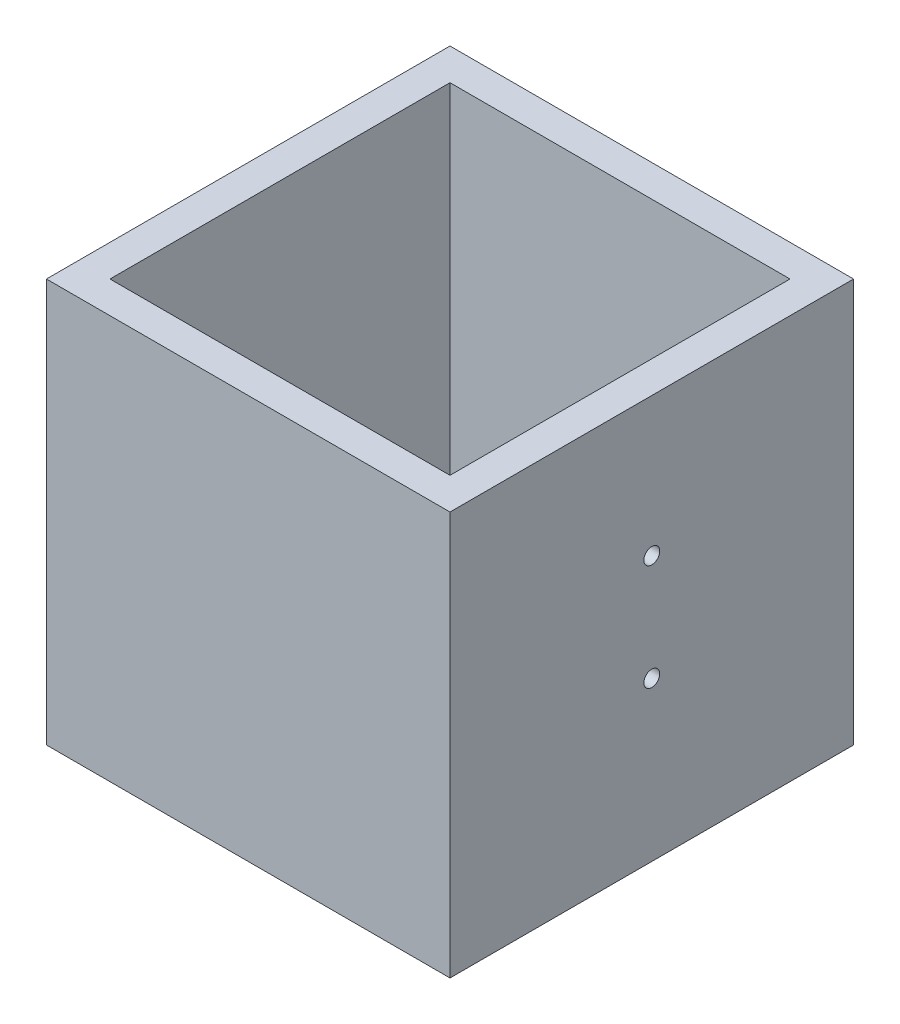
ISO-10303-21;
HEADER;
FILE_DESCRIPTION(('STEP AP214'),'2;1');
FILE_NAME('part.step','',(''),(''),'','','');
FILE_SCHEMA(('AUTOMOTIVE_DESIGN { 1 0 10303 214 1 1 1 1 }'));
ENDSEC;
DATA;
#1=APPLICATION_CONTEXT('core data for automotive mechanical design processes');
#2=APPLICATION_PROTOCOL_DEFINITION('international standard','automotive_design',2000,#1);
#3=PRODUCT_CONTEXT('',#1,'mechanical');
#4=PRODUCT('Part','Part','',(#3));
#5=PRODUCT_RELATED_PRODUCT_CATEGORY('part','',(#4));
#6=PRODUCT_DEFINITION_FORMATION('','',#4);
#7=PRODUCT_DEFINITION_CONTEXT('part definition',#1,'design');
#8=PRODUCT_DEFINITION('design','',#6,#7);
#9=PRODUCT_DEFINITION_SHAPE('','',#8);
#10=(LENGTH_UNIT() NAMED_UNIT(*) SI_UNIT(.MILLI.,.METRE.));
#11=(NAMED_UNIT(*) PLANE_ANGLE_UNIT() SI_UNIT($,.RADIAN.));
#12=(NAMED_UNIT(*) SI_UNIT($,.STERADIAN.) SOLID_ANGLE_UNIT());
#13=UNCERTAINTY_MEASURE_WITH_UNIT(LENGTH_MEASURE(1.E-05),#10,'distance_accuracy_value','');
#14=(GEOMETRIC_REPRESENTATION_CONTEXT(3) GLOBAL_UNCERTAINTY_ASSIGNED_CONTEXT((#13)) GLOBAL_UNIT_ASSIGNED_CONTEXT((#10,
#11,#12)) REPRESENTATION_CONTEXT('',''));
#15=CARTESIAN_POINT('',(0.,0.,0.));
#16=DIRECTION('',(0.,0.,1.));
#17=DIRECTION('',(1.,0.,0.));
#18=AXIS2_PLACEMENT_3D('',#15,#16,#17);
#19=CARTESIAN_POINT('',(-12.7,25.4,12.7));
#20=DIRECTION('',(1.,0.,0.));
#21=DIRECTION('',(0.,0.,-1.));
#22=AXIS2_PLACEMENT_3D('',#19,#20,#21);
#23=PLANE('',#22);
#24=DIRECTION('',(0.,0.,1.));
#25=VECTOR('',#24,1.);
#26=CARTESIAN_POINT('',(-12.7,0.,12.7));
#27=LINE('',#26,#25);
#28=CARTESIAN_POINT('',(-12.7,0.,-12.7));
#29=VERTEX_POINT('',#28);
#30=CARTESIAN_POINT('',(-12.7,0.,12.7));
#31=VERTEX_POINT('',#30);
#32=EDGE_CURVE('E213',#29,#31,#27,.T.);
#33=ORIENTED_EDGE('',*,*,#32,.T.);
#34=DIRECTION('',(0.,-1.,0.));
#35=VECTOR('',#34,1.);
#36=CARTESIAN_POINT('',(-12.7,25.4,12.7));
#37=LINE('',#36,#35);
#38=CARTESIAN_POINT('',(-12.7,25.4,12.7));
#39=VERTEX_POINT('',#38);
#40=EDGE_CURVE('E218',#39,#31,#37,.T.);
#41=ORIENTED_EDGE('',*,*,#40,.F.);
#42=DIRECTION('',(0.,0.,1.));
#43=VECTOR('',#42,1.);
#44=CARTESIAN_POINT('',(-12.7,25.4,12.7));
#45=LINE('',#44,#43);
#46=CARTESIAN_POINT('',(-12.7,25.4,-12.7));
#47=VERTEX_POINT('',#46);
#48=EDGE_CURVE('E204',#47,#39,#45,.T.);
#49=ORIENTED_EDGE('',*,*,#48,.F.);
#50=DIRECTION('',(0.,-1.,0.));
#51=VECTOR('',#50,1.);
#52=CARTESIAN_POINT('',(-12.7,25.4,-12.7));
#53=LINE('',#52,#51);
#54=EDGE_CURVE('E46',#47,#29,#53,.T.);
#55=ORIENTED_EDGE('',*,*,#54,.T.);
#56=EDGE_LOOP('',(#33,#41,#49,#55));
#57=FACE_BOUND('',#56,.T.);
#58=DIRECTION('',(0.,0.,1.));
#59=VECTOR('',#58,1.);
#60=CARTESIAN_POINT('',(-12.7,1.5,0.));
#61=LINE('',#60,#59);
#62=CARTESIAN_POINT('',(-12.7,1.5,-11.2));
#63=VERTEX_POINT('',#62);
#64=CARTESIAN_POINT('',(-12.7,1.5,11.2));
#65=VERTEX_POINT('',#64);
#66=EDGE_CURVE('E136',#63,#65,#61,.T.);
#67=ORIENTED_EDGE('',*,*,#66,.F.);
#68=DIRECTION('',(0.,-1.,0.));
#69=VECTOR('',#68,1.);
#70=CARTESIAN_POINT('',(-12.7,25.4,-11.2));
#71=LINE('',#70,#69);
#72=CARTESIAN_POINT('',(-12.7,23.9,-11.2));
#73=VERTEX_POINT('',#72);
#74=EDGE_CURVE('E144',#73,#63,#71,.T.);
#75=ORIENTED_EDGE('',*,*,#74,.F.);
#76=DIRECTION('',(0.,0.,1.));
#77=VECTOR('',#76,1.);
#78=CARTESIAN_POINT('',(-12.7,23.9,0.));
#79=LINE('',#78,#77);
#80=CARTESIAN_POINT('',(-12.7,23.9,11.2));
#81=VERTEX_POINT('',#80);
#82=EDGE_CURVE('E54',#73,#81,#79,.T.);
#83=ORIENTED_EDGE('',*,*,#82,.T.);
#84=DIRECTION('',(0.,-1.,0.));
#85=VECTOR('',#84,1.);
#86=CARTESIAN_POINT('',(-12.7,25.4,11.2));
#87=LINE('',#86,#85);
#88=EDGE_CURVE('E149',#81,#65,#87,.T.);
#89=ORIENTED_EDGE('',*,*,#88,.T.);
#90=EDGE_LOOP('',(#67,#75,#83,#89));
#91=FACE_BOUND('',#90,.T.);
#92=ADVANCED_FACE('F37',(#57,#91),#23,.F.);
#93=CARTESIAN_POINT('',(0.,25.4,0.));
#94=DIRECTION('',(0.,-1.,0.));
#95=DIRECTION('',(0.,0.,-1.));
#96=AXIS2_PLACEMENT_3D('',#93,#94,#95);
#97=PLANE('',#96);
#98=DIRECTION('',(0.,0.,-1.));
#99=VECTOR('',#98,1.);
#100=CARTESIAN_POINT('',(12.7,25.4,12.7));
#101=LINE('',#100,#99);
#102=CARTESIAN_POINT('',(12.7,25.4,12.7));
#103=VERTEX_POINT('',#102);
#104=CARTESIAN_POINT('',(12.7,25.4,-12.7));
#105=VERTEX_POINT('',#104);
#106=EDGE_CURVE('E198',#103,#105,#101,.T.);
#107=ORIENTED_EDGE('',*,*,#106,.T.);
#108=DIRECTION('',(-1.,0.,0.));
#109=VECTOR('',#108,1.);
#110=CARTESIAN_POINT('',(-12.7,25.4,-12.7));
#111=LINE('',#110,#109);
#112=EDGE_CURVE('E201',#105,#47,#111,.T.);
#113=ORIENTED_EDGE('',*,*,#112,.T.);
#114=ORIENTED_EDGE('',*,*,#48,.T.);
#115=DIRECTION('',(1.,0.,0.));
#116=VECTOR('',#115,1.);
#117=CARTESIAN_POINT('',(-12.7,25.4,12.7));
#118=LINE('',#117,#116);
#119=EDGE_CURVE('E206',#39,#103,#118,.T.);
#120=ORIENTED_EDGE('',*,*,#119,.T.);
#121=EDGE_LOOP('',(#107,#113,#114,#120));
#122=FACE_BOUND('',#121,.T.);
#123=DIRECTION('',(0.,0.,-1.));
#124=VECTOR('',#123,1.);
#125=CARTESIAN_POINT('',(10.7,25.4,0.));
#126=LINE('',#125,#124);
#127=CARTESIAN_POINT('',(10.7,25.4,10.7));
#128=VERTEX_POINT('',#127);
#129=CARTESIAN_POINT('',(10.7,25.4,-10.7));
#130=VERTEX_POINT('',#129);
#131=EDGE_CURVE('E191',#128,#130,#126,.T.);
#132=ORIENTED_EDGE('',*,*,#131,.F.);
#133=DIRECTION('',(1.,0.,0.));
#134=VECTOR('',#133,1.);
#135=CARTESIAN_POINT('',(0.,25.4,10.7));
#136=LINE('',#135,#134);
#137=CARTESIAN_POINT('',(-10.7,25.4,10.7));
#138=VERTEX_POINT('',#137);
#139=EDGE_CURVE('E182',#138,#128,#136,.T.);
#140=ORIENTED_EDGE('',*,*,#139,.F.);
#141=DIRECTION('',(0.,0.,1.));
#142=VECTOR('',#141,1.);
#143=CARTESIAN_POINT('',(-10.7,25.4,0.));
#144=LINE('',#143,#142);
#145=CARTESIAN_POINT('',(-10.7,25.4,-10.7));
#146=VERTEX_POINT('',#145);
#147=EDGE_CURVE('E195',#146,#138,#144,.T.);
#148=ORIENTED_EDGE('',*,*,#147,.F.);
#149=DIRECTION('',(-1.,0.,0.));
#150=VECTOR('',#149,1.);
#151=CARTESIAN_POINT('',(0.,25.4,-10.7));
#152=LINE('',#151,#150);
#153=EDGE_CURVE('E193',#130,#146,#152,.T.);
#154=ORIENTED_EDGE('',*,*,#153,.F.);
#155=EDGE_LOOP('',(#132,#140,#148,#154));
#156=FACE_BOUND('',#155,.T.);
#157=ADVANCED_FACE('F246',(#122,#156),#97,.F.);
#158=CARTESIAN_POINT('',(12.7,25.4,12.7));
#159=DIRECTION('',(-1.,0.,0.));
#160=DIRECTION('',(0.,0.,1.));
#161=AXIS2_PLACEMENT_3D('',#158,#159,#160);
#162=PLANE('',#161);
#163=CARTESIAN_POINT('',(12.7,16.6696365356798,0.));
#164=DIRECTION('',(1.,0.,0.));
#165=DIRECTION('',(0.,0.,-1.));
#166=AXIS2_PLACEMENT_3D('',#163,#164,#165);
#167=CIRCLE('',#166,0.5);
#168=CARTESIAN_POINT('',(12.7,16.6696365356798,-0.5));
#169=VERTEX_POINT('',#168);
#170=EDGE_CURVE('E163',#169,#169,#167,.T.);
#171=ORIENTED_EDGE('',*,*,#170,.F.);
#172=EDGE_LOOP('',(#171));
#173=FACE_BOUND('',#172,.T.);
#174=CARTESIAN_POINT('',(12.7,9.98492812247434,0.));
#175=DIRECTION('',(1.,0.,0.));
#176=DIRECTION('',(0.,0.,-1.));
#177=AXIS2_PLACEMENT_3D('',#174,#175,#176);
#178=CIRCLE('',#177,0.5);
#179=CARTESIAN_POINT('',(12.7,9.98492812247434,-0.5));
#180=VERTEX_POINT('',#179);
#181=EDGE_CURVE('E166',#180,#180,#178,.T.);
#182=ORIENTED_EDGE('',*,*,#181,.F.);
#183=EDGE_LOOP('',(#182));
#184=FACE_BOUND('',#183,.T.);
#185=DIRECTION('',(0.,0.,-1.));
#186=VECTOR('',#185,1.);
#187=CARTESIAN_POINT('',(12.7,0.,12.7));
#188=LINE('',#187,#186);
#189=CARTESIAN_POINT('',(12.7,0.,12.7));
#190=VERTEX_POINT('',#189);
#191=CARTESIAN_POINT('',(12.7,0.,-12.7));
#192=VERTEX_POINT('',#191);
#193=EDGE_CURVE('E177',#190,#192,#188,.T.);
#194=ORIENTED_EDGE('',*,*,#193,.T.);
#195=DIRECTION('',(0.,-1.,0.));
#196=VECTOR('',#195,1.);
#197=CARTESIAN_POINT('',(12.7,25.4,-12.7));
#198=LINE('',#197,#196);
#199=EDGE_CURVE('E11',#105,#192,#198,.T.);
#200=ORIENTED_EDGE('',*,*,#199,.F.);
#201=ORIENTED_EDGE('',*,*,#106,.F.);
#202=DIRECTION('',(0.,-1.,0.));
#203=VECTOR('',#202,1.);
#204=CARTESIAN_POINT('',(12.7,25.4,12.7));
#205=LINE('',#204,#203);
#206=EDGE_CURVE('E208',#103,#190,#205,.T.);
#207=ORIENTED_EDGE('',*,*,#206,.T.);
#208=EDGE_LOOP('',(#194,#200,#201,#207));
#209=FACE_BOUND('',#208,.T.);
#210=ADVANCED_FACE('F39',(#173,#184,#209),#162,.F.);
#211=CARTESIAN_POINT('',(-12.7,25.4,-12.7));
#212=DIRECTION('',(0.,0.,1.));
#213=DIRECTION('',(1.,0.,0.));
#214=AXIS2_PLACEMENT_3D('',#211,#212,#213);
#215=PLANE('',#214);
#216=DIRECTION('',(-1.,0.,0.));
#217=VECTOR('',#216,1.);
#218=CARTESIAN_POINT('',(-12.7,0.,-12.7));
#219=LINE('',#218,#217);
#220=EDGE_CURVE('E211',#192,#29,#219,.T.);
#221=ORIENTED_EDGE('',*,*,#220,.T.);
#222=ORIENTED_EDGE('',*,*,#54,.F.);
#223=ORIENTED_EDGE('',*,*,#112,.F.);
#224=ORIENTED_EDGE('',*,*,#199,.T.);
#225=EDGE_LOOP('',(#221,#222,#223,#224));
#226=FACE_BOUND('',#225,.T.);
#227=ADVANCED_FACE('F271',(#226),#215,.F.);
#228=CARTESIAN_POINT('',(-12.7,25.4,12.7));
#229=DIRECTION('',(0.,0.,-1.));
#230=DIRECTION('',(-1.,0.,0.));
#231=AXIS2_PLACEMENT_3D('',#228,#229,#230);
#232=PLANE('',#231);
#233=DIRECTION('',(1.,0.,0.));
#234=VECTOR('',#233,1.);
#235=CARTESIAN_POINT('',(-12.7,0.,12.7));
#236=LINE('',#235,#234);
#237=EDGE_CURVE('E202',#31,#190,#236,.T.);
#238=ORIENTED_EDGE('',*,*,#237,.T.);
#239=ORIENTED_EDGE('',*,*,#206,.F.);
#240=ORIENTED_EDGE('',*,*,#119,.F.);
#241=ORIENTED_EDGE('',*,*,#40,.T.);
#242=EDGE_LOOP('',(#238,#239,#240,#241));
#243=FACE_BOUND('',#242,.T.);
#244=ADVANCED_FACE('F269',(#243),#232,.F.);
#245=CARTESIAN_POINT('',(0.,0.,0.));
#246=DIRECTION('',(0.,-1.,0.));
#247=DIRECTION('',(0.,0.,-1.));
#248=AXIS2_PLACEMENT_3D('',#245,#246,#247);
#249=PLANE('',#248);
#250=ORIENTED_EDGE('',*,*,#193,.F.);
#251=ORIENTED_EDGE('',*,*,#237,.F.);
#252=ORIENTED_EDGE('',*,*,#32,.F.);
#253=ORIENTED_EDGE('',*,*,#220,.F.);
#254=EDGE_LOOP('',(#250,#251,#252,#253));
#255=FACE_BOUND('',#254,.T.);
#256=ADVANCED_FACE('F232',(#255),#249,.T.);
#257=CARTESIAN_POINT('',(10.7,25.4,12.7));
#258=DIRECTION('',(-1.,0.,0.));
#259=DIRECTION('',(0.,0.,1.));
#260=AXIS2_PLACEMENT_3D('',#257,#258,#259);
#261=PLANE('',#260);
#262=CARTESIAN_POINT('',(10.7,16.6696365356798,0.));
#263=DIRECTION('',(-1.,0.,0.));
#264=DIRECTION('',(0.,0.,1.));
#265=AXIS2_PLACEMENT_3D('',#262,#263,#264);
#266=CIRCLE('',#265,0.5);
#267=CARTESIAN_POINT('',(10.7,16.6696365356798,0.5));
#268=VERTEX_POINT('',#267);
#269=EDGE_CURVE('E41',#268,#268,#266,.T.);
#270=ORIENTED_EDGE('',*,*,#269,.F.);
#271=EDGE_LOOP('',(#270));
#272=FACE_BOUND('',#271,.T.);
#273=CARTESIAN_POINT('',(10.7,9.98492812247434,0.));
#274=DIRECTION('',(-1.,0.,0.));
#275=DIRECTION('',(0.,0.,1.));
#276=AXIS2_PLACEMENT_3D('',#273,#274,#275);
#277=CIRCLE('',#276,0.5);
#278=CARTESIAN_POINT('',(10.7,9.98492812247434,0.5));
#279=VERTEX_POINT('',#278);
#280=EDGE_CURVE('E169',#279,#279,#277,.T.);
#281=ORIENTED_EDGE('',*,*,#280,.F.);
#282=EDGE_LOOP('',(#281));
#283=FACE_BOUND('',#282,.T.);
#284=DIRECTION('',(0.,0.,-1.));
#285=VECTOR('',#284,1.);
#286=CARTESIAN_POINT('',(10.7,2.,0.));
#287=LINE('',#286,#285);
#288=CARTESIAN_POINT('',(10.7,2.,10.7));
#289=VERTEX_POINT('',#288);
#290=CARTESIAN_POINT('',(10.7,2.,-10.7));
#291=VERTEX_POINT('',#290);
#292=EDGE_CURVE('E170',#289,#291,#287,.T.);
#293=ORIENTED_EDGE('',*,*,#292,.F.);
#294=DIRECTION('',(0.,-1.,0.));
#295=VECTOR('',#294,1.);
#296=CARTESIAN_POINT('',(10.7,25.4,10.7));
#297=LINE('',#296,#295);
#298=EDGE_CURVE('E179',#128,#289,#297,.T.);
#299=ORIENTED_EDGE('',*,*,#298,.F.);
#300=ORIENTED_EDGE('',*,*,#131,.T.);
#301=DIRECTION('',(0.,-1.,0.));
#302=VECTOR('',#301,1.);
#303=CARTESIAN_POINT('',(10.7,25.4,-10.7));
#304=LINE('',#303,#302);
#305=EDGE_CURVE('E174',#130,#291,#304,.T.);
#306=ORIENTED_EDGE('',*,*,#305,.T.);
#307=EDGE_LOOP('',(#293,#299,#300,#306));
#308=FACE_BOUND('',#307,.T.);
#309=ADVANCED_FACE('F228',(#272,#283,#308),#261,.T.);
#310=CARTESIAN_POINT('',(-12.7,25.4,-10.7));
#311=DIRECTION('',(0.,0.,1.));
#312=DIRECTION('',(1.,0.,0.));
#313=AXIS2_PLACEMENT_3D('',#310,#311,#312);
#314=PLANE('',#313);
#315=DIRECTION('',(-1.,0.,0.));
#316=VECTOR('',#315,1.);
#317=CARTESIAN_POINT('',(0.,2.,-10.7));
#318=LINE('',#317,#316);
#319=CARTESIAN_POINT('',(-10.7,2.,-10.7));
#320=VERTEX_POINT('',#319);
#321=EDGE_CURVE('E173',#291,#320,#318,.T.);
#322=ORIENTED_EDGE('',*,*,#321,.F.);
#323=ORIENTED_EDGE('',*,*,#305,.F.);
#324=ORIENTED_EDGE('',*,*,#153,.T.);
#325=DIRECTION('',(0.,-1.,0.));
#326=VECTOR('',#325,1.);
#327=CARTESIAN_POINT('',(-10.7,25.4,-10.7));
#328=LINE('',#327,#326);
#329=EDGE_CURVE('E178',#146,#320,#328,.T.);
#330=ORIENTED_EDGE('',*,*,#329,.T.);
#331=EDGE_LOOP('',(#322,#323,#324,#330));
#332=FACE_BOUND('',#331,.T.);
#333=ADVANCED_FACE('F231',(#332),#314,.T.);
#334=CARTESIAN_POINT('',(-10.7,25.4,12.7));
#335=DIRECTION('',(1.,0.,0.));
#336=DIRECTION('',(0.,0.,-1.));
#337=AXIS2_PLACEMENT_3D('',#334,#335,#336);
#338=PLANE('',#337);
#339=DIRECTION('',(0.,0.,1.));
#340=VECTOR('',#339,1.);
#341=CARTESIAN_POINT('',(-10.7,2.,0.));
#342=LINE('',#341,#340);
#343=CARTESIAN_POINT('',(-10.7,2.,10.7));
#344=VERTEX_POINT('',#343);
#345=EDGE_CURVE('E184',#320,#344,#342,.T.);
#346=ORIENTED_EDGE('',*,*,#345,.F.);
#347=ORIENTED_EDGE('',*,*,#329,.F.);
#348=ORIENTED_EDGE('',*,*,#147,.T.);
#349=DIRECTION('',(0.,-1.,0.));
#350=VECTOR('',#349,1.);
#351=CARTESIAN_POINT('',(-10.7,25.4,10.7));
#352=LINE('',#351,#350);
#353=EDGE_CURVE('E62',#138,#344,#352,.T.);
#354=ORIENTED_EDGE('',*,*,#353,.T.);
#355=EDGE_LOOP('',(#346,#347,#348,#354));
#356=FACE_BOUND('',#355,.T.);
#357=ADVANCED_FACE('F251',(#356),#338,.T.);
#358=CARTESIAN_POINT('',(-12.7,25.4,10.7));
#359=DIRECTION('',(0.,0.,-1.));
#360=DIRECTION('',(-1.,0.,0.));
#361=AXIS2_PLACEMENT_3D('',#358,#359,#360);
#362=PLANE('',#361);
#363=DIRECTION('',(1.,0.,0.));
#364=VECTOR('',#363,1.);
#365=CARTESIAN_POINT('',(0.,2.,10.7));
#366=LINE('',#365,#364);
#367=EDGE_CURVE('E188',#344,#289,#366,.T.);
#368=ORIENTED_EDGE('',*,*,#367,.F.);
#369=ORIENTED_EDGE('',*,*,#353,.F.);
#370=ORIENTED_EDGE('',*,*,#139,.T.);
#371=ORIENTED_EDGE('',*,*,#298,.T.);
#372=EDGE_LOOP('',(#368,#369,#370,#371));
#373=FACE_BOUND('',#372,.T.);
#374=ADVANCED_FACE('F242',(#373),#362,.T.);
#375=CARTESIAN_POINT('',(0.,2.,0.));
#376=DIRECTION('',(0.,-1.,0.));
#377=DIRECTION('',(0.,0.,-1.));
#378=AXIS2_PLACEMENT_3D('',#375,#376,#377);
#379=PLANE('',#378);
#380=ORIENTED_EDGE('',*,*,#292,.T.);
#381=ORIENTED_EDGE('',*,*,#321,.T.);
#382=ORIENTED_EDGE('',*,*,#345,.T.);
#383=ORIENTED_EDGE('',*,*,#367,.T.);
#384=EDGE_LOOP('',(#380,#381,#382,#383));
#385=FACE_BOUND('',#384,.T.);
#386=ADVANCED_FACE('F240',(#385),#379,.F.);
#387=CARTESIAN_POINT('',(6.30000000000001,9.98492812247434,0.));
#388=DIRECTION('',(1.,0.,0.));
#389=DIRECTION('',(0.,0.,-1.));
#390=AXIS2_PLACEMENT_3D('',#387,#388,#389);
#391=CYLINDRICAL_SURFACE('',#390,0.5);
#392=ORIENTED_EDGE('',*,*,#280,.T.);
#393=EDGE_LOOP('',(#392));
#394=FACE_BOUND('',#393,.T.);
#395=ORIENTED_EDGE('',*,*,#181,.T.);
#396=EDGE_LOOP('',(#395));
#397=FACE_BOUND('',#396,.T.);
#398=ADVANCED_FACE('F225',(#394,#397),#391,.F.);
#399=CARTESIAN_POINT('',(6.30000000000001,16.6696365356798,0.));
#400=DIRECTION('',(1.,0.,0.));
#401=DIRECTION('',(0.,0.,-1.));
#402=AXIS2_PLACEMENT_3D('',#399,#400,#401);
#403=CYLINDRICAL_SURFACE('',#402,0.5);
#404=ORIENTED_EDGE('',*,*,#269,.T.);
#405=EDGE_LOOP('',(#404));
#406=FACE_BOUND('',#405,.T.);
#407=ORIENTED_EDGE('',*,*,#170,.T.);
#408=EDGE_LOOP('',(#407));
#409=FACE_BOUND('',#408,.T.);
#410=ADVANCED_FACE('F300',(#406,#409),#403,.F.);
#411=CARTESIAN_POINT('',(0.,23.9,0.));
#412=DIRECTION('',(0.,-1.,0.));
#413=DIRECTION('',(0.,0.,-1.));
#414=AXIS2_PLACEMENT_3D('',#411,#412,#413);
#415=PLANE('',#414);
#416=DIRECTION('',(0.,0.,1.));
#417=VECTOR('',#416,1.);
#418=CARTESIAN_POINT('',(-12.2,23.9,0.));
#419=LINE('',#418,#417);
#420=CARTESIAN_POINT('',(-12.2,23.9,-11.2));
#421=VERTEX_POINT('',#420);
#422=CARTESIAN_POINT('',(-12.2,23.9,11.2));
#423=VERTEX_POINT('',#422);
#424=EDGE_CURVE('E141',#421,#423,#419,.T.);
#425=ORIENTED_EDGE('',*,*,#424,.T.);
#426=DIRECTION('',(1.,0.,0.));
#427=VECTOR('',#426,1.);
#428=CARTESIAN_POINT('',(0.,23.9,11.2));
#429=LINE('',#428,#427);
#430=EDGE_CURVE('E158',#81,#423,#429,.T.);
#431=ORIENTED_EDGE('',*,*,#430,.F.);
#432=ORIENTED_EDGE('',*,*,#82,.F.);
#433=DIRECTION('',(-1.,0.,0.));
#434=VECTOR('',#433,1.);
#435=CARTESIAN_POINT('',(0.,23.9,-11.2));
#436=LINE('',#435,#434);
#437=EDGE_CURVE('E146',#421,#73,#436,.T.);
#438=ORIENTED_EDGE('',*,*,#437,.F.);
#439=EDGE_LOOP('',(#425,#431,#432,#438));
#440=FACE_BOUND('',#439,.T.);
#441=ADVANCED_FACE('F305',(#440),#415,.T.);
#442=CARTESIAN_POINT('',(-12.7,25.4,-11.2));
#443=DIRECTION('',(0.,0.,1.));
#444=DIRECTION('',(1.,0.,0.));
#445=AXIS2_PLACEMENT_3D('',#442,#443,#444);
#446=PLANE('',#445);
#447=DIRECTION('',(0.,1.,0.));
#448=VECTOR('',#447,1.);
#449=CARTESIAN_POINT('',(-12.2,25.4,-11.2));
#450=LINE('',#449,#448);
#451=CARTESIAN_POINT('',(-12.2,1.5,-11.2));
#452=VERTEX_POINT('',#451);
#453=EDGE_CURVE('E148',#452,#421,#450,.T.);
#454=ORIENTED_EDGE('',*,*,#453,.T.);
#455=ORIENTED_EDGE('',*,*,#437,.T.);
#456=ORIENTED_EDGE('',*,*,#74,.T.);
#457=DIRECTION('',(-1.,0.,0.));
#458=VECTOR('',#457,1.);
#459=CARTESIAN_POINT('',(0.,1.5,-11.2));
#460=LINE('',#459,#458);
#461=EDGE_CURVE('E131',#452,#63,#460,.T.);
#462=ORIENTED_EDGE('',*,*,#461,.F.);
#463=EDGE_LOOP('',(#454,#455,#456,#462));
#464=FACE_BOUND('',#463,.T.);
#465=ADVANCED_FACE('F145',(#464),#446,.T.);
#466=CARTESIAN_POINT('',(-12.7,25.4,11.2));
#467=DIRECTION('',(0.,0.,-1.));
#468=DIRECTION('',(-1.,0.,0.));
#469=AXIS2_PLACEMENT_3D('',#466,#467,#468);
#470=PLANE('',#469);
#471=DIRECTION('',(1.,0.,0.));
#472=VECTOR('',#471,1.);
#473=CARTESIAN_POINT('',(0.,1.5,11.2));
#474=LINE('',#473,#472);
#475=CARTESIAN_POINT('',(-12.2,1.5,11.2));
#476=VERTEX_POINT('',#475);
#477=EDGE_CURVE('E152',#65,#476,#474,.T.);
#478=ORIENTED_EDGE('',*,*,#477,.F.);
#479=ORIENTED_EDGE('',*,*,#88,.F.);
#480=ORIENTED_EDGE('',*,*,#430,.T.);
#481=DIRECTION('',(0.,1.,0.));
#482=VECTOR('',#481,1.);
#483=CARTESIAN_POINT('',(-12.2,25.4,11.2));
#484=LINE('',#483,#482);
#485=EDGE_CURVE('E160',#476,#423,#484,.T.);
#486=ORIENTED_EDGE('',*,*,#485,.F.);
#487=EDGE_LOOP('',(#478,#479,#480,#486));
#488=FACE_BOUND('',#487,.T.);
#489=ADVANCED_FACE('F315',(#488),#470,.T.);
#490=CARTESIAN_POINT('',(0.,1.5,0.));
#491=DIRECTION('',(0.,-1.,0.));
#492=DIRECTION('',(0.,0.,-1.));
#493=AXIS2_PLACEMENT_3D('',#490,#491,#492);
#494=PLANE('',#493);
#495=DIRECTION('',(0.,0.,-1.));
#496=VECTOR('',#495,1.);
#497=CARTESIAN_POINT('',(-12.2,1.5,12.7));
#498=LINE('',#497,#496);
#499=EDGE_CURVE('E139',#476,#452,#498,.T.);
#500=ORIENTED_EDGE('',*,*,#499,.T.);
#501=ORIENTED_EDGE('',*,*,#461,.T.);
#502=ORIENTED_EDGE('',*,*,#66,.T.);
#503=ORIENTED_EDGE('',*,*,#477,.T.);
#504=EDGE_LOOP('',(#500,#501,#502,#503));
#505=FACE_BOUND('',#504,.T.);
#506=ADVANCED_FACE('F133',(#505),#494,.F.);
#507=CARTESIAN_POINT('',(-12.2,25.4,12.7));
#508=DIRECTION('',(1.,0.,0.));
#509=DIRECTION('',(0.,0.,-1.));
#510=AXIS2_PLACEMENT_3D('',#507,#508,#509);
#511=PLANE('',#510);
#512=ORIENTED_EDGE('',*,*,#485,.T.);
#513=ORIENTED_EDGE('',*,*,#424,.F.);
#514=ORIENTED_EDGE('',*,*,#453,.F.);
#515=ORIENTED_EDGE('',*,*,#499,.F.);
#516=EDGE_LOOP('',(#512,#513,#514,#515));
#517=FACE_BOUND('',#516,.T.);
#518=ADVANCED_FACE('F309',(#517),#511,.F.);
#519=CLOSED_SHELL('',(#92,#157,#210,#227,#244,#256,#309,#333,#357,#374,#386,#398,#410,#441,#465,
#489,#506,#518));
#520=MANIFOLD_SOLID_BREP('B2',#519);
#521=ADVANCED_BREP_SHAPE_REPRESENTATION('',(#18,#520),#14);
#522=SHAPE_DEFINITION_REPRESENTATION(#9,#521);
ENDSEC;
END-ISO-10303-21;
